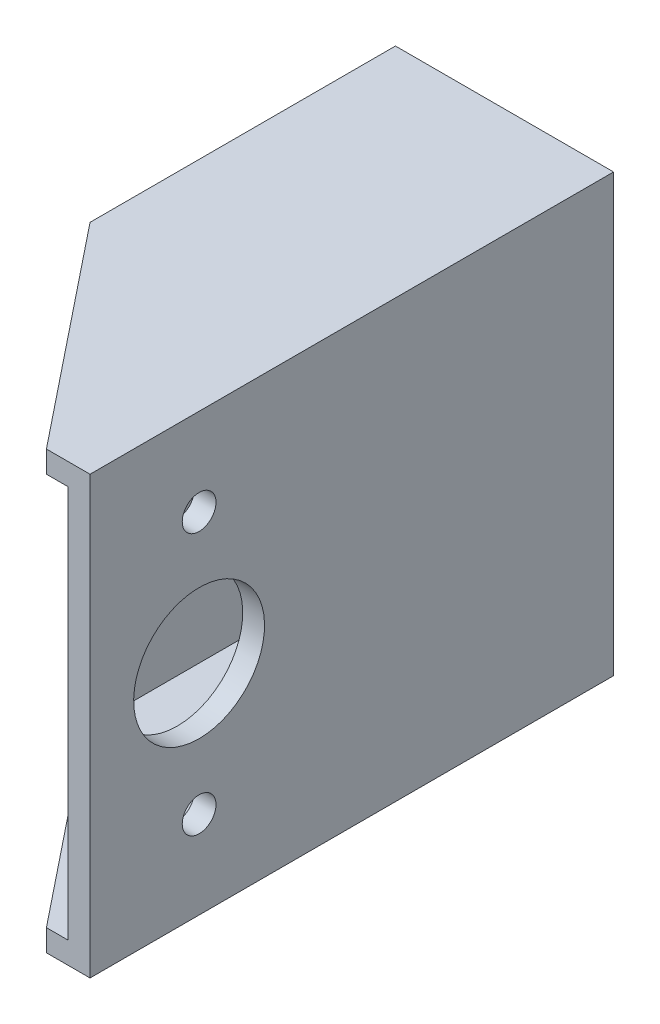
ISO-10303-21;
HEADER;
FILE_DESCRIPTION(('STEP AP214'),'2;1');
FILE_NAME('part.step','',(''),(''),'','','');
FILE_SCHEMA(('AUTOMOTIVE_DESIGN { 1 0 10303 214 1 1 1 1 }'));
ENDSEC;
DATA;
#1=APPLICATION_CONTEXT('core data for automotive mechanical design processes');
#2=APPLICATION_PROTOCOL_DEFINITION('international standard','automotive_design',2000,#1);
#3=PRODUCT_CONTEXT('',#1,'mechanical');
#4=PRODUCT('Part','Part','',(#3));
#5=PRODUCT_RELATED_PRODUCT_CATEGORY('part','',(#4));
#6=PRODUCT_DEFINITION_FORMATION('','',#4);
#7=PRODUCT_DEFINITION_CONTEXT('part definition',#1,'design');
#8=PRODUCT_DEFINITION('design','',#6,#7);
#9=PRODUCT_DEFINITION_SHAPE('','',#8);
#10=(LENGTH_UNIT() NAMED_UNIT(*) SI_UNIT(.MILLI.,.METRE.));
#11=(NAMED_UNIT(*) PLANE_ANGLE_UNIT() SI_UNIT($,.RADIAN.));
#12=(NAMED_UNIT(*) SI_UNIT($,.STERADIAN.) SOLID_ANGLE_UNIT());
#13=UNCERTAINTY_MEASURE_WITH_UNIT(LENGTH_MEASURE(1.E-05),#10,'distance_accuracy_value','');
#14=(GEOMETRIC_REPRESENTATION_CONTEXT(3) GLOBAL_UNCERTAINTY_ASSIGNED_CONTEXT((#13)) GLOBAL_UNIT_ASSIGNED_CONTEXT((#10,
#11,#12)) REPRESENTATION_CONTEXT('',''));
#15=CARTESIAN_POINT('',(0.,0.,0.));
#16=DIRECTION('',(0.,0.,1.));
#17=DIRECTION('',(1.,0.,0.));
#18=AXIS2_PLACEMENT_3D('',#15,#16,#17);
#19=CARTESIAN_POINT('',(0.,0.,76.2));
#20=DIRECTION('',(0.,0.,1.));
#21=DIRECTION('',(1.,0.,0.));
#22=AXIS2_PLACEMENT_3D('',#19,#20,#21);
#23=PLANE('',#22);
#24=DIRECTION('',(0.,1.,0.));
#25=VECTOR('',#24,1.);
#26=CARTESIAN_POINT('',(13.2352727193805,-101.649519117321,76.2));
#27=LINE('',#26,#25);
#28=CARTESIAN_POINT('',(13.2352727193805,-60.9896802096228,76.2));
#29=VERTEX_POINT('',#28);
#30=CARTESIAN_POINT('',(13.2352727193805,-57.8146802096228,76.2));
#31=VERTEX_POINT('',#30);
#32=EDGE_CURVE('E115',#29,#31,#27,.T.);
#33=ORIENTED_EDGE('',*,*,#32,.F.);
#34=DIRECTION('',(1.,0.,0.));
#35=VECTOR('',#34,1.);
#36=CARTESIAN_POINT('',(-12.1647272806195,-60.9896802096228,76.2));
#37=LINE('',#36,#35);
#38=CARTESIAN_POINT('',(19.5852727193805,-60.9896802096228,76.2));
#39=VERTEX_POINT('',#38);
#40=EDGE_CURVE('E134',#29,#39,#37,.T.);
#41=ORIENTED_EDGE('',*,*,#40,.T.);
#42=DIRECTION('',(0.,1.,0.));
#43=VECTOR('',#42,1.);
#44=CARTESIAN_POINT('',(19.5852727193805,2.51031979037716,76.2));
#45=LINE('',#44,#43);
#46=CARTESIAN_POINT('',(19.5852727193805,2.51031979037716,76.2));
#47=VERTEX_POINT('',#46);
#48=EDGE_CURVE('E129',#39,#47,#45,.T.);
#49=ORIENTED_EDGE('',*,*,#48,.T.);
#50=DIRECTION('',(-1.,0.,0.));
#51=VECTOR('',#50,1.);
#52=CARTESIAN_POINT('',(-12.1647272806195,2.51031979037716,76.2));
#53=LINE('',#52,#51);
#54=CARTESIAN_POINT('',(13.2352727193805,2.51031979037716,76.2));
#55=VERTEX_POINT('',#54);
#56=EDGE_CURVE('E122',#47,#55,#53,.T.);
#57=ORIENTED_EDGE('',*,*,#56,.T.);
#58=CARTESIAN_POINT('',(13.2352727193805,-0.664680209622834,76.2));
#59=VERTEX_POINT('',#58);
#60=EDGE_CURVE('E107',#59,#55,#27,.T.);
#61=ORIENTED_EDGE('',*,*,#60,.F.);
#62=DIRECTION('',(-1.,0.,0.));
#63=VECTOR('',#62,1.);
#64=CARTESIAN_POINT('',(-8.98972728061951,-0.664680209622838,76.2));
#65=LINE('',#64,#63);
#66=CARTESIAN_POINT('',(16.4102727193805,-0.664680209622838,76.2));
#67=VERTEX_POINT('',#66);
#68=EDGE_CURVE('E176',#67,#59,#65,.T.);
#69=ORIENTED_EDGE('',*,*,#68,.F.);
#70=DIRECTION('',(0.,1.,0.));
#71=VECTOR('',#70,1.);
#72=CARTESIAN_POINT('',(16.4102727193805,-0.664680209622838,76.2));
#73=LINE('',#72,#71);
#74=CARTESIAN_POINT('',(16.4102727193805,-57.8146802096228,76.2));
#75=VERTEX_POINT('',#74);
#76=EDGE_CURVE('E192',#75,#67,#73,.T.);
#77=ORIENTED_EDGE('',*,*,#76,.F.);
#78=DIRECTION('',(1.,0.,0.));
#79=VECTOR('',#78,1.);
#80=CARTESIAN_POINT('',(-8.98972728061951,-57.8146802096228,76.2));
#81=LINE('',#80,#79);
#82=EDGE_CURVE('E180',#31,#75,#81,.T.);
#83=ORIENTED_EDGE('',*,*,#82,.F.);
#84=EDGE_LOOP('',(#33,#41,#49,#57,#61,#69,#77,#83));
#85=FACE_BOUND('',#84,.T.);
#86=ADVANCED_FACE('F32',(#85),#23,.T.);
#87=CARTESIAN_POINT('',(0.,0.,0.));
#88=DIRECTION('',(0.,0.,1.));
#89=DIRECTION('',(1.,0.,0.));
#90=AXIS2_PLACEMENT_3D('',#87,#88,#89);
#91=PLANE('',#90);
#92=DIRECTION('',(0.,-1.,0.));
#93=VECTOR('',#92,1.);
#94=CARTESIAN_POINT('',(-12.1647272806195,2.51031979037716,0.));
#95=LINE('',#94,#93);
#96=CARTESIAN_POINT('',(-12.1647272806195,2.51031979037716,0.));
#97=VERTEX_POINT('',#96);
#98=CARTESIAN_POINT('',(-12.1647272806195,-60.9896802096228,0.));
#99=VERTEX_POINT('',#98);
#100=EDGE_CURVE('E138',#97,#99,#95,.T.);
#101=ORIENTED_EDGE('',*,*,#100,.F.);
#102=DIRECTION('',(-1.,0.,0.));
#103=VECTOR('',#102,1.);
#104=CARTESIAN_POINT('',(-12.1647272806195,2.51031979037716,0.));
#105=LINE('',#104,#103);
#106=CARTESIAN_POINT('',(19.5852727193805,2.51031979037716,0.));
#107=VERTEX_POINT('',#106);
#108=EDGE_CURVE('E146',#107,#97,#105,.T.);
#109=ORIENTED_EDGE('',*,*,#108,.F.);
#110=DIRECTION('',(0.,1.,0.));
#111=VECTOR('',#110,1.);
#112=CARTESIAN_POINT('',(19.5852727193805,2.51031979037716,0.));
#113=LINE('',#112,#111);
#114=CARTESIAN_POINT('',(19.5852727193805,-60.9896802096228,0.));
#115=VERTEX_POINT('',#114);
#116=EDGE_CURVE('E144',#115,#107,#113,.T.);
#117=ORIENTED_EDGE('',*,*,#116,.F.);
#118=DIRECTION('',(1.,0.,0.));
#119=VECTOR('',#118,1.);
#120=CARTESIAN_POINT('',(-12.1647272806195,-60.9896802096228,0.));
#121=LINE('',#120,#119);
#122=EDGE_CURVE('E141',#99,#115,#121,.T.);
#123=ORIENTED_EDGE('',*,*,#122,.F.);
#124=EDGE_LOOP('',(#101,#109,#117,#123));
#125=FACE_BOUND('',#124,.T.);
#126=DIRECTION('',(0.,-1.,0.));
#127=VECTOR('',#126,1.);
#128=CARTESIAN_POINT('',(-8.98972728061951,-0.664680209622838,0.));
#129=LINE('',#128,#127);
#130=CARTESIAN_POINT('',(-8.98972728061951,-0.664680209622838,0.));
#131=VERTEX_POINT('',#130);
#132=CARTESIAN_POINT('',(-8.98972728061951,-57.8146802096228,0.));
#133=VERTEX_POINT('',#132);
#134=EDGE_CURVE('E187',#131,#133,#129,.T.);
#135=ORIENTED_EDGE('',*,*,#134,.T.);
#136=DIRECTION('',(1.,0.,0.));
#137=VECTOR('',#136,1.);
#138=CARTESIAN_POINT('',(-8.98972728061951,-57.8146802096228,0.));
#139=LINE('',#138,#137);
#140=CARTESIAN_POINT('',(16.4102727193805,-57.8146802096228,0.));
#141=VERTEX_POINT('',#140);
#142=EDGE_CURVE('E184',#133,#141,#139,.T.);
#143=ORIENTED_EDGE('',*,*,#142,.T.);
#144=DIRECTION('',(0.,1.,0.));
#145=VECTOR('',#144,1.);
#146=CARTESIAN_POINT('',(16.4102727193805,-0.664680209622838,0.));
#147=LINE('',#146,#145);
#148=CARTESIAN_POINT('',(16.4102727193805,-0.664680209622838,0.));
#149=VERTEX_POINT('',#148);
#150=EDGE_CURVE('E181',#141,#149,#147,.T.);
#151=ORIENTED_EDGE('',*,*,#150,.T.);
#152=DIRECTION('',(-1.,0.,0.));
#153=VECTOR('',#152,1.);
#154=CARTESIAN_POINT('',(-8.98972728061951,-0.664680209622838,0.));
#155=LINE('',#154,#153);
#156=EDGE_CURVE('E177',#149,#131,#155,.T.);
#157=ORIENTED_EDGE('',*,*,#156,.T.);
#158=EDGE_LOOP('',(#135,#143,#151,#157));
#159=FACE_BOUND('',#158,.T.);
#160=ADVANCED_FACE('F163',(#125,#159),#91,.F.);
#161=CARTESIAN_POINT('',(-12.1647272806195,2.51031979037716,76.2));
#162=DIRECTION('',(1.,0.,0.));
#163=DIRECTION('',(0.,1.,0.));
#164=AXIS2_PLACEMENT_3D('',#161,#162,#163);
#165=PLANE('',#164);
#166=DIRECTION('',(0.,0.,-1.));
#167=VECTOR('',#166,1.);
#168=CARTESIAN_POINT('',(-12.1647272806195,-60.9896802096228,76.2));
#169=LINE('',#168,#167);
#170=CARTESIAN_POINT('',(-12.1647272806195,-60.9896802096228,44.45));
#171=VERTEX_POINT('',#170);
#172=EDGE_CURVE('E40',#171,#99,#169,.T.);
#173=ORIENTED_EDGE('',*,*,#172,.F.);
#174=DIRECTION('',(0.,1.,0.));
#175=VECTOR('',#174,1.);
#176=CARTESIAN_POINT('',(-12.1647272806195,-101.649519117321,44.45));
#177=LINE('',#176,#175);
#178=CARTESIAN_POINT('',(-12.1647272806195,2.51031979037716,44.45));
#179=VERTEX_POINT('',#178);
#180=EDGE_CURVE('E166',#171,#179,#177,.T.);
#181=ORIENTED_EDGE('',*,*,#180,.T.);
#182=DIRECTION('',(0.,0.,-1.));
#183=VECTOR('',#182,1.);
#184=CARTESIAN_POINT('',(-12.1647272806195,2.51031979037716,76.2));
#185=LINE('',#184,#183);
#186=EDGE_CURVE('E124',#179,#97,#185,.T.);
#187=ORIENTED_EDGE('',*,*,#186,.T.);
#188=ORIENTED_EDGE('',*,*,#100,.T.);
#189=EDGE_LOOP('',(#173,#181,#187,#188));
#190=FACE_BOUND('',#189,.T.);
#191=ADVANCED_FACE('F34',(#190),#165,.F.);
#192=CARTESIAN_POINT('',(-12.1647272806195,-60.9896802096228,76.2));
#193=DIRECTION('',(0.,1.,0.));
#194=DIRECTION('',(0.,0.,1.));
#195=AXIS2_PLACEMENT_3D('',#192,#193,#194);
#196=PLANE('',#195);
#197=ORIENTED_EDGE('',*,*,#40,.F.);
#198=DIRECTION('',(0.624695047554424,0.,0.78086880944303));
#199=VECTOR('',#198,1.);
#200=CARTESIAN_POINT('',(-29.1004434637924,-60.9896802096228,23.2803547710339));
#201=LINE('',#200,#199);
#202=EDGE_CURVE('E158',#171,#29,#201,.T.);
#203=ORIENTED_EDGE('',*,*,#202,.F.);
#204=ORIENTED_EDGE('',*,*,#172,.T.);
#205=ORIENTED_EDGE('',*,*,#122,.T.);
#206=DIRECTION('',(0.,0.,-1.));
#207=VECTOR('',#206,1.);
#208=CARTESIAN_POINT('',(19.5852727193805,-60.9896802096228,76.2));
#209=LINE('',#208,#207);
#210=EDGE_CURVE('E149',#39,#115,#209,.T.);
#211=ORIENTED_EDGE('',*,*,#210,.F.);
#212=EDGE_LOOP('',(#197,#203,#204,#205,#211));
#213=FACE_BOUND('',#212,.T.);
#214=ADVANCED_FACE('F156',(#213),#196,.F.);
#215=CARTESIAN_POINT('',(19.5852727193805,2.51031979037716,76.2));
#216=DIRECTION('',(-1.,0.,0.));
#217=DIRECTION('',(0.,-1.,0.));
#218=AXIS2_PLACEMENT_3D('',#215,#216,#217);
#219=PLANE('',#218);
#220=CARTESIAN_POINT('',(19.5852727193805,-48.2896802096228,60.325));
#221=DIRECTION('',(-1.,0.,0.));
#222=DIRECTION('',(0.,0.,1.));
#223=AXIS2_PLACEMENT_3D('',#220,#221,#222);
#224=CIRCLE('',#223,2.45745);
#225=CARTESIAN_POINT('',(19.5852727193805,-48.2896802096228,62.78245));
#226=VERTEX_POINT('',#225);
#227=EDGE_CURVE('E210',#226,#226,#224,.T.);
#228=ORIENTED_EDGE('',*,*,#227,.T.);
#229=EDGE_LOOP('',(#228));
#230=FACE_BOUND('',#229,.T.);
#231=CARTESIAN_POINT('',(19.5852727193805,-10.1896802096228,60.325));
#232=DIRECTION('',(-1.,0.,0.));
#233=DIRECTION('',(0.,0.,1.));
#234=AXIS2_PLACEMENT_3D('',#231,#232,#233);
#235=CIRCLE('',#234,2.45745);
#236=CARTESIAN_POINT('',(19.5852727193805,-10.1896802096228,62.78245));
#237=VERTEX_POINT('',#236);
#238=EDGE_CURVE('E204',#237,#237,#235,.T.);
#239=ORIENTED_EDGE('',*,*,#238,.T.);
#240=EDGE_LOOP('',(#239));
#241=FACE_BOUND('',#240,.T.);
#242=CARTESIAN_POINT('',(19.5852727193805,-29.2396802096228,60.325));
#243=DIRECTION('',(-1.,0.,0.));
#244=DIRECTION('',(0.,-1.,0.));
#245=AXIS2_PLACEMENT_3D('',#242,#243,#244);
#246=CIRCLE('',#245,9.52499999999999);
#247=CARTESIAN_POINT('',(19.5852727193805,-38.7646802096228,60.325));
#248=VERTEX_POINT('',#247);
#249=EDGE_CURVE('E125',#248,#248,#246,.F.);
#250=ORIENTED_EDGE('',*,*,#249,.F.);
#251=EDGE_LOOP('',(#250));
#252=FACE_BOUND('',#251,.T.);
#253=ORIENTED_EDGE('',*,*,#116,.T.);
#254=DIRECTION('',(0.,0.,-1.));
#255=VECTOR('',#254,1.);
#256=CARTESIAN_POINT('',(19.5852727193805,2.51031979037716,76.2));
#257=LINE('',#256,#255);
#258=EDGE_CURVE('E132',#47,#107,#257,.T.);
#259=ORIENTED_EDGE('',*,*,#258,.F.);
#260=ORIENTED_EDGE('',*,*,#48,.F.);
#261=ORIENTED_EDGE('',*,*,#210,.T.);
#262=EDGE_LOOP('',(#253,#259,#260,#261));
#263=FACE_BOUND('',#262,.T.);
#264=ADVANCED_FACE('F168',(#230,#241,#252,#263),#219,.F.);
#265=CARTESIAN_POINT('',(-12.1647272806195,2.51031979037716,76.2));
#266=DIRECTION('',(0.,-1.,0.));
#267=DIRECTION('',(1.,0.,0.));
#268=AXIS2_PLACEMENT_3D('',#265,#266,#267);
#269=PLANE('',#268);
#270=ORIENTED_EDGE('',*,*,#186,.F.);
#271=DIRECTION('',(-0.624695047554424,0.,-0.78086880944303));
#272=VECTOR('',#271,1.);
#273=CARTESIAN_POINT('',(-29.1004434637924,2.51031979037716,23.2803547710339));
#274=LINE('',#273,#272);
#275=EDGE_CURVE('E110',#55,#179,#274,.T.);
#276=ORIENTED_EDGE('',*,*,#275,.F.);
#277=ORIENTED_EDGE('',*,*,#56,.F.);
#278=ORIENTED_EDGE('',*,*,#258,.T.);
#279=ORIENTED_EDGE('',*,*,#108,.T.);
#280=EDGE_LOOP('',(#270,#276,#277,#278,#279));
#281=FACE_BOUND('',#280,.T.);
#282=ADVANCED_FACE('F120',(#281),#269,.F.);
#283=CARTESIAN_POINT('',(-8.98972728061951,-0.664680209622838,76.2));
#284=DIRECTION('',(1.,0.,0.));
#285=DIRECTION('',(0.,1.,0.));
#286=AXIS2_PLACEMENT_3D('',#283,#284,#285);
#287=PLANE('',#286);
#288=DIRECTION('',(0.,1.,0.));
#289=VECTOR('',#288,1.);
#290=CARTESIAN_POINT('',(-8.98972728061951,-0.664680209622839,48.41875));
#291=LINE('',#290,#289);
#292=CARTESIAN_POINT('',(-8.98972728061951,-57.8146802096228,48.41875));
#293=VERTEX_POINT('',#292);
#294=CARTESIAN_POINT('',(-8.98972728061951,-0.664680209622838,48.41875));
#295=VERTEX_POINT('',#294);
#296=EDGE_CURVE('E46',#293,#295,#291,.T.);
#297=ORIENTED_EDGE('',*,*,#296,.F.);
#298=DIRECTION('',(0.,0.,-1.));
#299=VECTOR('',#298,1.);
#300=CARTESIAN_POINT('',(-8.98972728061951,-57.8146802096228,76.2));
#301=LINE('',#300,#299);
#302=EDGE_CURVE('E142',#293,#133,#301,.T.);
#303=ORIENTED_EDGE('',*,*,#302,.T.);
#304=ORIENTED_EDGE('',*,*,#134,.F.);
#305=DIRECTION('',(0.,0.,-1.));
#306=VECTOR('',#305,1.);
#307=CARTESIAN_POINT('',(-8.98972728061951,-0.664680209622838,76.2));
#308=LINE('',#307,#306);
#309=EDGE_CURVE('E174',#295,#131,#308,.T.);
#310=ORIENTED_EDGE('',*,*,#309,.F.);
#311=EDGE_LOOP('',(#297,#303,#304,#310));
#312=FACE_BOUND('',#311,.T.);
#313=ADVANCED_FACE('F240',(#312),#287,.T.);
#314=CARTESIAN_POINT('',(-8.98972728061951,-57.8146802096228,76.2));
#315=DIRECTION('',(0.,1.,0.));
#316=DIRECTION('',(0.,0.,1.));
#317=AXIS2_PLACEMENT_3D('',#314,#315,#316);
#318=PLANE('',#317);
#319=DIRECTION('',(-0.624695047554424,0.,-0.78086880944303));
#320=VECTOR('',#319,1.);
#321=CARTESIAN_POINT('',(4.56210198767317,-57.8146802096228,65.3585365853659));
#322=LINE('',#321,#320);
#323=EDGE_CURVE('E190',#31,#293,#322,.T.);
#324=ORIENTED_EDGE('',*,*,#323,.F.);
#325=ORIENTED_EDGE('',*,*,#82,.T.);
#326=DIRECTION('',(0.,0.,-1.));
#327=VECTOR('',#326,1.);
#328=CARTESIAN_POINT('',(16.4102727193805,-57.8146802096228,76.2));
#329=LINE('',#328,#327);
#330=EDGE_CURVE('E171',#75,#141,#329,.T.);
#331=ORIENTED_EDGE('',*,*,#330,.T.);
#332=ORIENTED_EDGE('',*,*,#142,.F.);
#333=ORIENTED_EDGE('',*,*,#302,.F.);
#334=EDGE_LOOP('',(#324,#325,#331,#332,#333));
#335=FACE_BOUND('',#334,.T.);
#336=ADVANCED_FACE('F223',(#335),#318,.T.);
#337=CARTESIAN_POINT('',(16.4102727193805,-0.664680209622838,76.2));
#338=DIRECTION('',(-1.,0.,0.));
#339=DIRECTION('',(0.,-1.,0.));
#340=AXIS2_PLACEMENT_3D('',#337,#338,#339);
#341=PLANE('',#340);
#342=CARTESIAN_POINT('',(16.4102727193805,-48.2896802096228,60.325));
#343=DIRECTION('',(-1.,0.,0.));
#344=DIRECTION('',(0.,0.,1.));
#345=AXIS2_PLACEMENT_3D('',#342,#343,#344);
#346=CIRCLE('',#345,2.45745);
#347=CARTESIAN_POINT('',(16.4102727193805,-48.2896802096228,62.78245));
#348=VERTEX_POINT('',#347);
#349=EDGE_CURVE('E213',#348,#348,#346,.T.);
#350=ORIENTED_EDGE('',*,*,#349,.F.);
#351=EDGE_LOOP('',(#350));
#352=FACE_BOUND('',#351,.T.);
#353=CARTESIAN_POINT('',(16.4102727193805,-10.1896802096228,60.325));
#354=DIRECTION('',(-1.,0.,0.));
#355=DIRECTION('',(0.,0.,1.));
#356=AXIS2_PLACEMENT_3D('',#353,#354,#355);
#357=CIRCLE('',#356,2.45745);
#358=CARTESIAN_POINT('',(16.4102727193805,-10.1896802096228,62.78245));
#359=VERTEX_POINT('',#358);
#360=EDGE_CURVE('E207',#359,#359,#357,.T.);
#361=ORIENTED_EDGE('',*,*,#360,.F.);
#362=EDGE_LOOP('',(#361));
#363=FACE_BOUND('',#362,.T.);
#364=CARTESIAN_POINT('',(16.4102727193805,-29.2396802096228,60.325));
#365=DIRECTION('',(-1.,0.,0.));
#366=DIRECTION('',(0.,-1.,0.));
#367=AXIS2_PLACEMENT_3D('',#364,#365,#366);
#368=CIRCLE('',#367,9.52499999999999);
#369=CARTESIAN_POINT('',(16.4102727193805,-38.7646802096228,60.325));
#370=VERTEX_POINT('',#369);
#371=EDGE_CURVE('E201',#370,#370,#368,.T.);
#372=ORIENTED_EDGE('',*,*,#371,.F.);
#373=EDGE_LOOP('',(#372));
#374=FACE_BOUND('',#373,.T.);
#375=ORIENTED_EDGE('',*,*,#150,.F.);
#376=ORIENTED_EDGE('',*,*,#330,.F.);
#377=ORIENTED_EDGE('',*,*,#76,.T.);
#378=DIRECTION('',(0.,0.,-1.));
#379=VECTOR('',#378,1.);
#380=CARTESIAN_POINT('',(16.4102727193805,-0.664680209622838,76.2));
#381=LINE('',#380,#379);
#382=EDGE_CURVE('E54',#67,#149,#381,.T.);
#383=ORIENTED_EDGE('',*,*,#382,.T.);
#384=EDGE_LOOP('',(#375,#376,#377,#383));
#385=FACE_BOUND('',#384,.T.);
#386=ADVANCED_FACE('F219',(#352,#363,#374,#385),#341,.T.);
#387=CARTESIAN_POINT('',(-8.98972728061951,-0.664680209622838,76.2));
#388=DIRECTION('',(0.,-1.,0.));
#389=DIRECTION('',(0.,0.,-1.));
#390=AXIS2_PLACEMENT_3D('',#387,#388,#389);
#391=PLANE('',#390);
#392=DIRECTION('',(0.624695047554424,0.,0.78086880944303));
#393=VECTOR('',#392,1.);
#394=CARTESIAN_POINT('',(4.56210198767317,-0.664680209622838,65.3585365853659));
#395=LINE('',#394,#393);
#396=EDGE_CURVE('E11',#295,#59,#395,.T.);
#397=ORIENTED_EDGE('',*,*,#396,.F.);
#398=ORIENTED_EDGE('',*,*,#309,.T.);
#399=ORIENTED_EDGE('',*,*,#156,.F.);
#400=ORIENTED_EDGE('',*,*,#382,.F.);
#401=ORIENTED_EDGE('',*,*,#68,.T.);
#402=EDGE_LOOP('',(#397,#398,#399,#400,#401));
#403=FACE_BOUND('',#402,.T.);
#404=ADVANCED_FACE('F222',(#403),#391,.T.);
#405=CARTESIAN_POINT('',(-29.1004434637924,-101.649519117321,23.2803547710339));
#406=DIRECTION('',(0.78086880944303,0.,-0.624695047554424));
#407=DIRECTION('',(-0.624695047554424,0.,-0.78086880944303));
#408=AXIS2_PLACEMENT_3D('',#405,#406,#407);
#409=PLANE('',#408);
#410=ORIENTED_EDGE('',*,*,#323,.T.);
#411=ORIENTED_EDGE('',*,*,#296,.T.);
#412=ORIENTED_EDGE('',*,*,#396,.T.);
#413=ORIENTED_EDGE('',*,*,#60,.T.);
#414=ORIENTED_EDGE('',*,*,#275,.T.);
#415=ORIENTED_EDGE('',*,*,#180,.F.);
#416=ORIENTED_EDGE('',*,*,#202,.T.);
#417=ORIENTED_EDGE('',*,*,#32,.T.);
#418=EDGE_LOOP('',(#410,#411,#412,#413,#414,#415,#416,#417));
#419=FACE_BOUND('',#418,.T.);
#420=ADVANCED_FACE('F109',(#419),#409,.F.);
#421=CARTESIAN_POINT('',(46.5260410825879,-29.2396802096228,60.325));
#422=DIRECTION('',(-1.,0.,0.));
#423=DIRECTION('',(0.,-1.,0.));
#424=AXIS2_PLACEMENT_3D('',#421,#422,#423);
#425=CYLINDRICAL_SURFACE('',#424,9.52499999999999);
#426=CARTESIAN_POINT('',(19.5852727193805,-38.7646802096228,60.325));
#427=CARTESIAN_POINT('',(19.5521998027138,-38.7646802096228,60.325));
#428=CARTESIAN_POINT('',(19.5191268860472,-38.7646802096228,60.325));
#429=CARTESIAN_POINT('',(19.4529810527138,-38.7646802096228,60.325));
#430=CARTESIAN_POINT('',(19.4199081360472,-38.7646802096228,60.325));
#431=CARTESIAN_POINT('',(19.3537623027138,-38.7646802096228,60.325));
#432=CARTESIAN_POINT('',(19.3206893860472,-38.7646802096228,60.325));
#433=CARTESIAN_POINT('',(19.2545435527138,-38.7646802096228,60.325));
#434=CARTESIAN_POINT('',(19.2214706360472,-38.7646802096228,60.325));
#435=CARTESIAN_POINT('',(19.1553248027138,-38.7646802096228,60.325));
#436=CARTESIAN_POINT('',(19.1222518860472,-38.7646802096228,60.325));
#437=CARTESIAN_POINT('',(19.0561060527138,-38.7646802096228,60.325));
#438=CARTESIAN_POINT('',(19.0230331360472,-38.7646802096228,60.325));
#439=CARTESIAN_POINT('',(18.9568873027138,-38.7646802096228,60.325));
#440=CARTESIAN_POINT('',(18.9238143860472,-38.7646802096228,60.325));
#441=CARTESIAN_POINT('',(18.8576685527138,-38.7646802096228,60.325));
#442=CARTESIAN_POINT('',(18.8245956360472,-38.7646802096228,60.325));
#443=CARTESIAN_POINT('',(18.7584498027138,-38.7646802096228,60.325));
#444=CARTESIAN_POINT('',(18.7253768860472,-38.7646802096228,60.325));
#445=CARTESIAN_POINT('',(18.6592310527138,-38.7646802096228,60.325));
#446=CARTESIAN_POINT('',(18.6261581360472,-38.7646802096228,60.325));
#447=CARTESIAN_POINT('',(18.5600123027138,-38.7646802096228,60.325));
#448=CARTESIAN_POINT('',(18.5269393860472,-38.7646802096228,60.325));
#449=CARTESIAN_POINT('',(18.4607935527138,-38.7646802096228,60.325));
#450=CARTESIAN_POINT('',(18.4277206360472,-38.7646802096228,60.325));
#451=CARTESIAN_POINT('',(18.3615748027138,-38.7646802096228,60.325));
#452=CARTESIAN_POINT('',(18.3285018860472,-38.7646802096228,60.325));
#453=CARTESIAN_POINT('',(18.2623560527138,-38.7646802096228,60.325));
#454=CARTESIAN_POINT('',(18.2292831360472,-38.7646802096228,60.325));
#455=CARTESIAN_POINT('',(18.1631373027138,-38.7646802096228,60.325));
#456=CARTESIAN_POINT('',(18.1300643860472,-38.7646802096228,60.325));
#457=CARTESIAN_POINT('',(18.0639185527138,-38.7646802096228,60.325));
#458=CARTESIAN_POINT('',(18.0308456360472,-38.7646802096228,60.325));
#459=CARTESIAN_POINT('',(17.9646998027138,-38.7646802096228,60.325));
#460=CARTESIAN_POINT('',(17.9316268860472,-38.7646802096228,60.325));
#461=CARTESIAN_POINT('',(17.8654810527138,-38.7646802096228,60.325));
#462=CARTESIAN_POINT('',(17.8324081360472,-38.7646802096228,60.325));
#463=CARTESIAN_POINT('',(17.7662623027138,-38.7646802096228,60.325));
#464=CARTESIAN_POINT('',(17.7331893860472,-38.7646802096228,60.325));
#465=CARTESIAN_POINT('',(17.6670435527138,-38.7646802096228,60.325));
#466=CARTESIAN_POINT('',(17.6339706360472,-38.7646802096228,60.325));
#467=CARTESIAN_POINT('',(17.5678248027138,-38.7646802096228,60.325));
#468=CARTESIAN_POINT('',(17.5347518860472,-38.7646802096228,60.325));
#469=CARTESIAN_POINT('',(17.4686060527138,-38.7646802096228,60.325));
#470=CARTESIAN_POINT('',(17.4355331360472,-38.7646802096228,60.325));
#471=CARTESIAN_POINT('',(17.3693873027138,-38.7646802096228,60.325));
#472=CARTESIAN_POINT('',(17.3363143860472,-38.7646802096228,60.325));
#473=CARTESIAN_POINT('',(17.2701685527138,-38.7646802096228,60.325));
#474=CARTESIAN_POINT('',(17.2370956360472,-38.7646802096228,60.325));
#475=CARTESIAN_POINT('',(17.1709498027138,-38.7646802096228,60.325));
#476=CARTESIAN_POINT('',(17.1378768860472,-38.7646802096228,60.325));
#477=CARTESIAN_POINT('',(17.0717310527138,-38.7646802096228,60.325));
#478=CARTESIAN_POINT('',(17.0386581360472,-38.7646802096228,60.325));
#479=CARTESIAN_POINT('',(16.9725123027138,-38.7646802096228,60.325));
#480=CARTESIAN_POINT('',(16.9394393860472,-38.7646802096228,60.325));
#481=CARTESIAN_POINT('',(16.8732935527138,-38.7646802096228,60.325));
#482=CARTESIAN_POINT('',(16.8402206360472,-38.7646802096228,60.325));
#483=CARTESIAN_POINT('',(16.7740748027138,-38.7646802096228,60.325));
#484=CARTESIAN_POINT('',(16.7410018860472,-38.7646802096228,60.325));
#485=CARTESIAN_POINT('',(16.6748560527138,-38.7646802096228,60.325));
#486=CARTESIAN_POINT('',(16.6417831360472,-38.7646802096228,60.325));
#487=CARTESIAN_POINT('',(16.5756373027138,-38.7646802096228,60.325));
#488=CARTESIAN_POINT('',(16.5425643860472,-38.7646802096228,60.325));
#489=CARTESIAN_POINT('',(16.4764185527138,-38.7646802096228,60.325));
#490=CARTESIAN_POINT('',(16.4433456360472,-38.7646802096228,60.325));
#491=CARTESIAN_POINT('',(16.4102727193805,-38.7646802096228,60.325));
#492=B_SPLINE_CURVE_WITH_KNOTS('',3,(#426,#427,#428,#429,#430,#431,#432,#433,#434,#435,#436,
#437,#438,#439,#440,#441,#442,#443,#444,#445,#446,#447,#448,#449,#450,#451,#452,#453,#454,#455,
#456,#457,#458,#459,#460,#461,#462,#463,#464,#465,#466,#467,#468,#469,#470,#471,#472,#473,#474,
#475,#476,#477,#478,#479,#480,#481,#482,#483,#484,#485,#486,#487,#488,#489,#490,#491),
.UNSPECIFIED.,.F.,.F.,(4,2,2,2,2,2,2,2,2,2,2,2,2,2,2,2,2,2,2,2,2,2,2,2,2,2,2,2,2,2,2,2,4),(0.,
0.0992187500000012,0.198437499999999,0.29765625,0.396875000000001,0.496093749999999,0.5953125,
0.694531250000002,0.793750000000003,0.892968750000001,0.992187500000002,1.09140625,1.190625,
1.28984375,1.3890625,1.48828125,1.5875,1.68671875,1.7859375,1.88515625,1.984375,2.08359375,
2.1828125,2.28203125,2.38125,2.48046875,2.5796875,2.67890625,2.778125,2.87734375,
2.97656250000001,3.07578125,3.175),.UNSPECIFIED.);
#493=EDGE_CURVE('BSEAM321',#248,#370,#492,.T.);
#494=ORIENTED_EDGE('',*,*,#249,.T.);
#495=ORIENTED_EDGE('',*,*,#371,.T.);
#496=ORIENTED_EDGE('',*,*,#493,.T.);
#497=ORIENTED_EDGE('',*,*,#493,.F.);
#498=EDGE_LOOP('',(#494,#496,#495,#497));
#499=FACE_BOUND('',#498,.T.);
#500=ADVANCED_FACE('F321',(#499),#425,.F.);
#501=CARTESIAN_POINT('',(16.4102727193805,-10.1896802096228,60.325));
#502=DIRECTION('',(-1.,0.,0.));
#503=DIRECTION('',(0.,0.,1.));
#504=AXIS2_PLACEMENT_3D('',#501,#502,#503);
#505=CYLINDRICAL_SURFACE('',#504,2.45745);
#506=ORIENTED_EDGE('',*,*,#238,.F.);
#507=EDGE_LOOP('',(#506));
#508=FACE_BOUND('',#507,.T.);
#509=ORIENTED_EDGE('',*,*,#360,.T.);
#510=EDGE_LOOP('',(#509));
#511=FACE_BOUND('',#510,.T.);
#512=ADVANCED_FACE('F328',(#508,#511),#505,.F.);
#513=CARTESIAN_POINT('',(16.4102727193805,-48.2896802096228,60.325));
#514=DIRECTION('',(-1.,0.,0.));
#515=DIRECTION('',(0.,0.,1.));
#516=AXIS2_PLACEMENT_3D('',#513,#514,#515);
#517=CYLINDRICAL_SURFACE('',#516,2.45745);
#518=ORIENTED_EDGE('',*,*,#227,.F.);
#519=EDGE_LOOP('',(#518));
#520=FACE_BOUND('',#519,.T.);
#521=ORIENTED_EDGE('',*,*,#349,.T.);
#522=EDGE_LOOP('',(#521));
#523=FACE_BOUND('',#522,.T.);
#524=ADVANCED_FACE('F217',(#520,#523),#517,.F.);
#525=CLOSED_SHELL('',(#86,#160,#191,#214,#264,#282,#313,#336,#386,#404,#420,#500,#512,#524));
#526=MANIFOLD_SOLID_BREP('B2',#525);
#527=ADVANCED_BREP_SHAPE_REPRESENTATION('',(#18,#526),#14);
#528=SHAPE_DEFINITION_REPRESENTATION(#9,#527);
ENDSEC;
END-ISO-10303-21;
